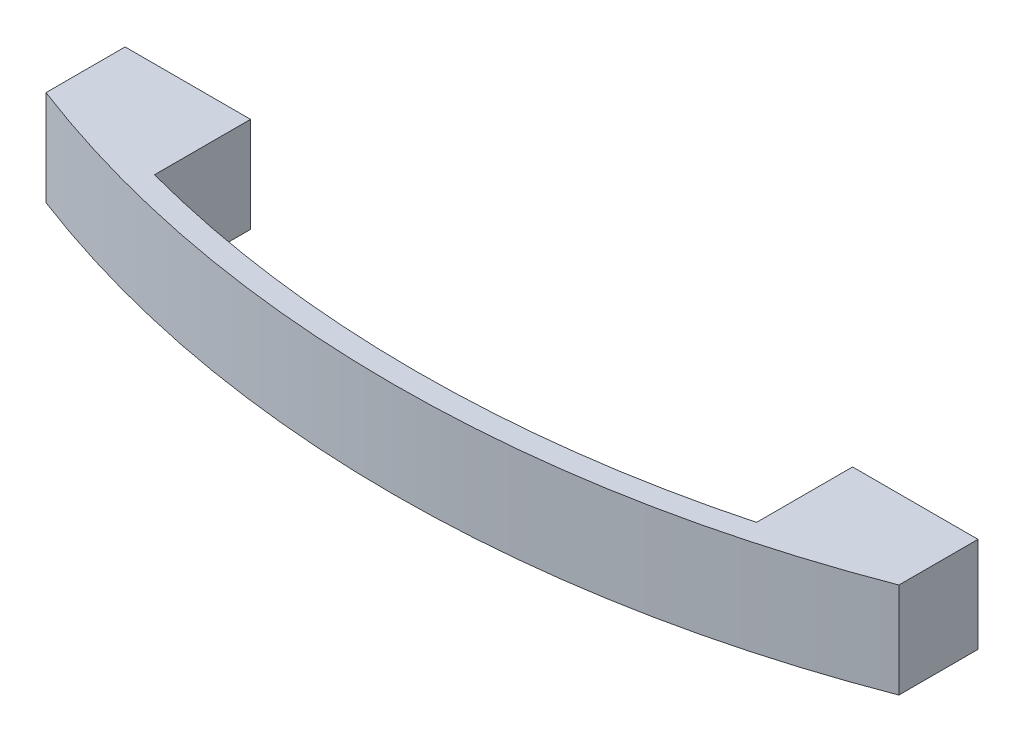
ISO-10303-21;
HEADER;
FILE_DESCRIPTION(('STEP AP214'),'2;1');
FILE_NAME('part.step','',(''),(''),'','','');
FILE_SCHEMA(('AUTOMOTIVE_DESIGN { 1 0 10303 214 1 1 1 1 }'));
ENDSEC;
DATA;
#1=APPLICATION_CONTEXT('core data for automotive mechanical design processes');
#2=APPLICATION_PROTOCOL_DEFINITION('international standard','automotive_design',2000,#1);
#3=PRODUCT_CONTEXT('',#1,'mechanical');
#4=PRODUCT('Part','Part','',(#3));
#5=PRODUCT_RELATED_PRODUCT_CATEGORY('part','',(#4));
#6=PRODUCT_DEFINITION_FORMATION('','',#4);
#7=PRODUCT_DEFINITION_CONTEXT('part definition',#1,'design');
#8=PRODUCT_DEFINITION('design','',#6,#7);
#9=PRODUCT_DEFINITION_SHAPE('','',#8);
#10=(LENGTH_UNIT() NAMED_UNIT(*) SI_UNIT(.MILLI.,.METRE.));
#11=(NAMED_UNIT(*) PLANE_ANGLE_UNIT() SI_UNIT($,.RADIAN.));
#12=(NAMED_UNIT(*) SI_UNIT($,.STERADIAN.) SOLID_ANGLE_UNIT());
#13=UNCERTAINTY_MEASURE_WITH_UNIT(LENGTH_MEASURE(1.E-05),#10,'distance_accuracy_value','');
#14=(GEOMETRIC_REPRESENTATION_CONTEXT(3) GLOBAL_UNCERTAINTY_ASSIGNED_CONTEXT((#13)) GLOBAL_UNIT_ASSIGNED_CONTEXT((#10,
#11,#12)) REPRESENTATION_CONTEXT('',''));
#15=CARTESIAN_POINT('',(0.,0.,0.));
#16=DIRECTION('',(0.,0.,1.));
#17=DIRECTION('',(1.,0.,0.));
#18=AXIS2_PLACEMENT_3D('',#15,#16,#17);
#19=CARTESIAN_POINT('',(0.,19.,0.));
#20=DIRECTION('',(0.,-1.,0.));
#21=DIRECTION('',(0.,0.,-1.));
#22=AXIS2_PLACEMENT_3D('',#19,#20,#21);
#23=CYLINDRICAL_SURFACE('',#22,233.);
#24=CARTESIAN_POINT('',(0.,0.,0.));
#25=DIRECTION('',(0.,-1.,0.));
#26=DIRECTION('',(0.,0.,1.));
#27=AXIS2_PLACEMENT_3D('',#24,#25,#26);
#28=CIRCLE('',#27,233.);
#29=CARTESIAN_POINT('',(60.,0.,225.142177301367));
#30=VERTEX_POINT('',#29);
#31=CARTESIAN_POINT('',(-60.,0.,225.142177301367));
#32=VERTEX_POINT('',#31);
#33=EDGE_CURVE('E156',#30,#32,#28,.T.);
#34=ORIENTED_EDGE('',*,*,#33,.T.);
#35=DIRECTION('',(0.,-1.,0.));
#36=VECTOR('',#35,1.);
#37=CARTESIAN_POINT('',(-60.,19.,225.142177301367));
#38=LINE('',#37,#36);
#39=CARTESIAN_POINT('',(-60.,19.,225.142177301367));
#40=VERTEX_POINT('',#39);
#41=EDGE_CURVE('E138',#40,#32,#38,.T.);
#42=ORIENTED_EDGE('',*,*,#41,.F.);
#43=CARTESIAN_POINT('',(0.,19.,0.));
#44=DIRECTION('',(0.,-1.,0.));
#45=DIRECTION('',(0.,0.,1.));
#46=AXIS2_PLACEMENT_3D('',#43,#44,#45);
#47=CIRCLE('',#46,233.);
#48=CARTESIAN_POINT('',(60.,19.,225.142177301367));
#49=VERTEX_POINT('',#48);
#50=EDGE_CURVE('E144',#49,#40,#47,.T.);
#51=ORIENTED_EDGE('',*,*,#50,.F.);
#52=DIRECTION('',(0.,-1.,0.));
#53=VECTOR('',#52,1.);
#54=CARTESIAN_POINT('',(60.,19.,225.142177301367));
#55=LINE('',#54,#53);
#56=EDGE_CURVE('E231',#49,#30,#55,.T.);
#57=ORIENTED_EDGE('',*,*,#56,.T.);
#58=EDGE_LOOP('',(#34,#42,#51,#57));
#59=FACE_BOUND('',#58,.T.);
#60=ADVANCED_FACE('F41',(#59),#23,.F.);
#61=CARTESIAN_POINT('',(-60.,19.,225.142177301367));
#62=DIRECTION('',(-1.,0.,0.));
#63=DIRECTION('',(0.,0.,1.));
#64=AXIS2_PLACEMENT_3D('',#61,#62,#63);
#65=PLANE('',#64);
#66=DIRECTION('',(0.,0.,-1.));
#67=VECTOR('',#66,1.);
#68=CARTESIAN_POINT('',(-60.,0.,225.142177301367));
#69=LINE('',#68,#67);
#70=CARTESIAN_POINT('',(-59.9999999999999,0.,206.));
#71=VERTEX_POINT('',#70);
#72=EDGE_CURVE('E245',#32,#71,#69,.T.);
#73=ORIENTED_EDGE('',*,*,#72,.T.);
#74=DIRECTION('',(0.,1.,0.));
#75=VECTOR('',#74,1.);
#76=CARTESIAN_POINT('',(-59.9999999999999,19.,206.));
#77=LINE('',#76,#75);
#78=CARTESIAN_POINT('',(-59.9999999999999,19.,206.));
#79=VERTEX_POINT('',#78);
#80=EDGE_CURVE('E141',#71,#79,#77,.T.);
#81=ORIENTED_EDGE('',*,*,#80,.T.);
#82=DIRECTION('',(0.,0.,-1.));
#83=VECTOR('',#82,1.);
#84=CARTESIAN_POINT('',(-60.,19.,225.142177301367));
#85=LINE('',#84,#83);
#86=EDGE_CURVE('E133',#40,#79,#85,.T.);
#87=ORIENTED_EDGE('',*,*,#86,.F.);
#88=ORIENTED_EDGE('',*,*,#41,.T.);
#89=EDGE_LOOP('',(#73,#81,#87,#88));
#90=FACE_BOUND('',#89,.T.);
#91=ADVANCED_FACE('F136',(#90),#65,.F.);
#92=CARTESIAN_POINT('',(-59.9999999999999,19.,205.));
#93=DIRECTION('',(0.,0.,1.));
#94=DIRECTION('',(1.,0.,0.));
#95=AXIS2_PLACEMENT_3D('',#92,#93,#94);
#96=PLANE('',#95);
#97=DIRECTION('',(1.,0.,0.));
#98=VECTOR('',#97,1.);
#99=CARTESIAN_POINT('',(-59.9999999999999,18.,205.));
#100=LINE('',#99,#98);
#101=CARTESIAN_POINT('',(-83.9999999999999,18.,205.));
#102=VERTEX_POINT('',#101);
#103=CARTESIAN_POINT('',(-60.9999999999999,18.,205.));
#104=VERTEX_POINT('',#103);
#105=EDGE_CURVE('E168',#102,#104,#100,.T.);
#106=ORIENTED_EDGE('',*,*,#105,.T.);
#107=DIRECTION('',(0.,-1.,0.));
#108=VECTOR('',#107,1.);
#109=CARTESIAN_POINT('',(-60.9999999999999,19.,205.));
#110=LINE('',#109,#108);
#111=CARTESIAN_POINT('',(-60.9999999999999,0.999999999999987,205.));
#112=VERTEX_POINT('',#111);
#113=EDGE_CURVE('E170',#104,#112,#110,.T.);
#114=ORIENTED_EDGE('',*,*,#113,.T.);
#115=DIRECTION('',(-1.,0.,0.));
#116=VECTOR('',#115,1.);
#117=CARTESIAN_POINT('',(-59.9999999999999,0.999999999999987,205.));
#118=LINE('',#117,#116);
#119=CARTESIAN_POINT('',(-83.9999999999999,0.999999999999987,205.));
#120=VERTEX_POINT('',#119);
#121=EDGE_CURVE('E157',#112,#120,#118,.T.);
#122=ORIENTED_EDGE('',*,*,#121,.T.);
#123=DIRECTION('',(0.,1.,0.));
#124=VECTOR('',#123,1.);
#125=CARTESIAN_POINT('',(-83.9999999999999,19.,205.));
#126=LINE('',#125,#124);
#127=EDGE_CURVE('E160',#120,#102,#126,.T.);
#128=ORIENTED_EDGE('',*,*,#127,.T.);
#129=EDGE_LOOP('',(#106,#114,#122,#128));
#130=FACE_BOUND('',#129,.T.);
#131=ADVANCED_FACE('F271',(#130),#96,.F.);
#132=CARTESIAN_POINT('',(-84.9999999999999,19.,205.));
#133=DIRECTION('',(1.,0.,0.));
#134=DIRECTION('',(0.,0.,-1.));
#135=AXIS2_PLACEMENT_3D('',#132,#133,#134);
#136=PLANE('',#135);
#137=DIRECTION('',(0.,0.,1.));
#138=VECTOR('',#137,1.);
#139=CARTESIAN_POINT('',(-84.9999999999999,19.,205.));
#140=LINE('',#139,#138);
#141=CARTESIAN_POINT('',(-84.9999999999999,19.,206.));
#142=VERTEX_POINT('',#141);
#143=CARTESIAN_POINT('',(-84.9999999999999,19.,221.768460336451));
#144=VERTEX_POINT('',#143);
#145=EDGE_CURVE('E143',#142,#144,#140,.T.);
#146=ORIENTED_EDGE('',*,*,#145,.F.);
#147=DIRECTION('',(0.,-1.,0.));
#148=VECTOR('',#147,1.);
#149=CARTESIAN_POINT('',(-84.9999999999999,19.,206.));
#150=LINE('',#149,#148);
#151=CARTESIAN_POINT('',(-84.9999999999999,0.,206.));
#152=VERTEX_POINT('',#151);
#153=EDGE_CURVE('E178',#142,#152,#150,.T.);
#154=ORIENTED_EDGE('',*,*,#153,.T.);
#155=DIRECTION('',(0.,0.,1.));
#156=VECTOR('',#155,1.);
#157=CARTESIAN_POINT('',(-84.9999999999999,0.,205.));
#158=LINE('',#157,#156);
#159=CARTESIAN_POINT('',(-84.9999999999999,0.,221.768460336451));
#160=VERTEX_POINT('',#159);
#161=EDGE_CURVE('E243',#152,#160,#158,.T.);
#162=ORIENTED_EDGE('',*,*,#161,.T.);
#163=DIRECTION('',(0.,-1.,0.));
#164=VECTOR('',#163,1.);
#165=CARTESIAN_POINT('',(-84.9999999999999,19.,221.768460336451));
#166=LINE('',#165,#164);
#167=EDGE_CURVE('E158',#144,#160,#166,.T.);
#168=ORIENTED_EDGE('',*,*,#167,.F.);
#169=EDGE_LOOP('',(#146,#154,#162,#168));
#170=FACE_BOUND('',#169,.T.);
#171=ADVANCED_FACE('F259',(#170),#136,.F.);
#172=CARTESIAN_POINT('',(0.,19.,0.));
#173=DIRECTION('',(0.,-1.,0.));
#174=DIRECTION('',(0.,0.,-1.));
#175=AXIS2_PLACEMENT_3D('',#172,#173,#174);
#176=CYLINDRICAL_SURFACE('',#175,237.5);
#177=CARTESIAN_POINT('',(0.,0.,0.));
#178=DIRECTION('',(0.,1.,0.));
#179=DIRECTION('',(0.,0.,1.));
#180=AXIS2_PLACEMENT_3D('',#177,#178,#179);
#181=CIRCLE('',#180,237.5);
#182=CARTESIAN_POINT('',(84.9999999999999,0.,221.768460336451));
#183=VERTEX_POINT('',#182);
#184=EDGE_CURVE('E227',#160,#183,#181,.T.);
#185=ORIENTED_EDGE('',*,*,#184,.T.);
#186=DIRECTION('',(0.,-1.,0.));
#187=VECTOR('',#186,1.);
#188=CARTESIAN_POINT('',(84.9999999999999,19.,221.768460336451));
#189=LINE('',#188,#187);
#190=CARTESIAN_POINT('',(84.9999999999999,19.,221.768460336451));
#191=VERTEX_POINT('',#190);
#192=EDGE_CURVE('E163',#191,#183,#189,.T.);
#193=ORIENTED_EDGE('',*,*,#192,.F.);
#194=CARTESIAN_POINT('',(0.,19.,0.));
#195=DIRECTION('',(0.,1.,0.));
#196=DIRECTION('',(0.,0.,1.));
#197=AXIS2_PLACEMENT_3D('',#194,#195,#196);
#198=CIRCLE('',#197,237.5);
#199=EDGE_CURVE('E252',#144,#191,#198,.T.);
#200=ORIENTED_EDGE('',*,*,#199,.F.);
#201=ORIENTED_EDGE('',*,*,#167,.T.);
#202=EDGE_LOOP('',(#185,#193,#200,#201));
#203=FACE_BOUND('',#202,.T.);
#204=ADVANCED_FACE('F260',(#203),#176,.T.);
#205=CARTESIAN_POINT('',(85.,19.,205.));
#206=DIRECTION('',(-1.,0.,0.));
#207=DIRECTION('',(0.,0.,1.));
#208=AXIS2_PLACEMENT_3D('',#205,#206,#207);
#209=PLANE('',#208);
#210=DIRECTION('',(0.,0.,-1.));
#211=VECTOR('',#210,1.);
#212=CARTESIAN_POINT('',(85.,0.,205.));
#213=LINE('',#212,#211);
#214=CARTESIAN_POINT('',(85.,0.,206.));
#215=VERTEX_POINT('',#214);
#216=EDGE_CURVE('E225',#183,#215,#213,.T.);
#217=ORIENTED_EDGE('',*,*,#216,.T.);
#218=DIRECTION('',(0.,1.,0.));
#219=VECTOR('',#218,1.);
#220=CARTESIAN_POINT('',(85.,19.,206.));
#221=LINE('',#220,#219);
#222=CARTESIAN_POINT('',(85.,19.,206.));
#223=VERTEX_POINT('',#222);
#224=EDGE_CURVE('E51',#215,#223,#221,.T.);
#225=ORIENTED_EDGE('',*,*,#224,.T.);
#226=DIRECTION('',(0.,0.,-1.));
#227=VECTOR('',#226,1.);
#228=CARTESIAN_POINT('',(85.,19.,205.));
#229=LINE('',#228,#227);
#230=EDGE_CURVE('E239',#191,#223,#229,.T.);
#231=ORIENTED_EDGE('',*,*,#230,.F.);
#232=ORIENTED_EDGE('',*,*,#192,.T.);
#233=EDGE_LOOP('',(#217,#225,#231,#232));
#234=FACE_BOUND('',#233,.T.);
#235=ADVANCED_FACE('F236',(#234),#209,.F.);
#236=CARTESIAN_POINT('',(60.,19.,205.));
#237=DIRECTION('',(0.,0.,1.));
#238=DIRECTION('',(1.,0.,0.));
#239=AXIS2_PLACEMENT_3D('',#236,#237,#238);
#240=PLANE('',#239);
#241=DIRECTION('',(1.,0.,0.));
#242=VECTOR('',#241,1.);
#243=CARTESIAN_POINT('',(85.,18.,205.));
#244=LINE('',#243,#242);
#245=CARTESIAN_POINT('',(61.,18.,205.));
#246=VERTEX_POINT('',#245);
#247=CARTESIAN_POINT('',(84.,18.,205.));
#248=VERTEX_POINT('',#247);
#249=EDGE_CURVE('E59',#246,#248,#244,.T.);
#250=ORIENTED_EDGE('',*,*,#249,.T.);
#251=DIRECTION('',(0.,-1.,0.));
#252=VECTOR('',#251,1.);
#253=CARTESIAN_POINT('',(84.,19.,205.));
#254=LINE('',#253,#252);
#255=CARTESIAN_POINT('',(84.,0.999999999999973,205.));
#256=VERTEX_POINT('',#255);
#257=EDGE_CURVE('E188',#248,#256,#254,.T.);
#258=ORIENTED_EDGE('',*,*,#257,.T.);
#259=DIRECTION('',(-1.,0.,0.));
#260=VECTOR('',#259,1.);
#261=CARTESIAN_POINT('',(60.,0.999999999999973,205.));
#262=LINE('',#261,#260);
#263=CARTESIAN_POINT('',(61.,0.999999999999973,205.));
#264=VERTEX_POINT('',#263);
#265=EDGE_CURVE('E184',#256,#264,#262,.T.);
#266=ORIENTED_EDGE('',*,*,#265,.T.);
#267=DIRECTION('',(0.,1.,0.));
#268=VECTOR('',#267,1.);
#269=CARTESIAN_POINT('',(61.,19.,205.));
#270=LINE('',#269,#268);
#271=EDGE_CURVE('E64',#264,#246,#270,.T.);
#272=ORIENTED_EDGE('',*,*,#271,.T.);
#273=EDGE_LOOP('',(#250,#258,#266,#272));
#274=FACE_BOUND('',#273,.T.);
#275=ADVANCED_FACE('F268',(#274),#240,.F.);
#276=CARTESIAN_POINT('',(60.,19.,225.142177301367));
#277=DIRECTION('',(1.,0.,0.));
#278=DIRECTION('',(0.,0.,-1.));
#279=AXIS2_PLACEMENT_3D('',#276,#277,#278);
#280=PLANE('',#279);
#281=DIRECTION('',(0.,0.,1.));
#282=VECTOR('',#281,1.);
#283=CARTESIAN_POINT('',(60.,19.,225.142177301367));
#284=LINE('',#283,#282);
#285=CARTESIAN_POINT('',(60.,19.,206.));
#286=VERTEX_POINT('',#285);
#287=EDGE_CURVE('E149',#286,#49,#284,.T.);
#288=ORIENTED_EDGE('',*,*,#287,.F.);
#289=DIRECTION('',(0.,-1.,0.));
#290=VECTOR('',#289,1.);
#291=CARTESIAN_POINT('',(60.,19.,206.));
#292=LINE('',#291,#290);
#293=CARTESIAN_POINT('',(60.,0.,206.));
#294=VERTEX_POINT('',#293);
#295=EDGE_CURVE('E11',#286,#294,#292,.T.);
#296=ORIENTED_EDGE('',*,*,#295,.T.);
#297=DIRECTION('',(0.,0.,1.));
#298=VECTOR('',#297,1.);
#299=CARTESIAN_POINT('',(60.,0.,225.142177301367));
#300=LINE('',#299,#298);
#301=EDGE_CURVE('E153',#294,#30,#300,.T.);
#302=ORIENTED_EDGE('',*,*,#301,.T.);
#303=ORIENTED_EDGE('',*,*,#56,.F.);
#304=EDGE_LOOP('',(#288,#296,#302,#303));
#305=FACE_BOUND('',#304,.T.);
#306=ADVANCED_FACE('F219',(#305),#280,.F.);
#307=CARTESIAN_POINT('',(0.,19.,0.));
#308=DIRECTION('',(0.,1.,0.));
#309=DIRECTION('',(0.,0.,1.));
#310=AXIS2_PLACEMENT_3D('',#307,#308,#309);
#311=PLANE('',#310);
#312=ORIENTED_EDGE('',*,*,#86,.T.);
#313=DIRECTION('',(-1.,0.,0.));
#314=VECTOR('',#313,1.);
#315=CARTESIAN_POINT('',(-84.9999999999999,19.,206.));
#316=LINE('',#315,#314);
#317=EDGE_CURVE('E176',#79,#142,#316,.T.);
#318=ORIENTED_EDGE('',*,*,#317,.T.);
#319=ORIENTED_EDGE('',*,*,#145,.T.);
#320=ORIENTED_EDGE('',*,*,#199,.T.);
#321=ORIENTED_EDGE('',*,*,#230,.T.);
#322=DIRECTION('',(-1.,0.,0.));
#323=VECTOR('',#322,1.);
#324=CARTESIAN_POINT('',(60.,19.,206.));
#325=LINE('',#324,#323);
#326=EDGE_CURVE('E174',#223,#286,#325,.T.);
#327=ORIENTED_EDGE('',*,*,#326,.T.);
#328=ORIENTED_EDGE('',*,*,#287,.T.);
#329=ORIENTED_EDGE('',*,*,#50,.T.);
#330=EDGE_LOOP('',(#312,#318,#319,#320,#321,#327,#328,#329));
#331=FACE_BOUND('',#330,.T.);
#332=ADVANCED_FACE('F147',(#331),#311,.T.);
#333=CARTESIAN_POINT('',(0.,0.,0.));
#334=DIRECTION('',(0.,1.,0.));
#335=DIRECTION('',(0.,0.,1.));
#336=AXIS2_PLACEMENT_3D('',#333,#334,#335);
#337=PLANE('',#336);
#338=ORIENTED_EDGE('',*,*,#161,.F.);
#339=DIRECTION('',(1.,0.,0.));
#340=VECTOR('',#339,1.);
#341=CARTESIAN_POINT('',(0.,0.,206.));
#342=LINE('',#341,#340);
#343=EDGE_CURVE('E182',#152,#71,#342,.T.);
#344=ORIENTED_EDGE('',*,*,#343,.T.);
#345=ORIENTED_EDGE('',*,*,#72,.F.);
#346=ORIENTED_EDGE('',*,*,#33,.F.);
#347=ORIENTED_EDGE('',*,*,#301,.F.);
#348=DIRECTION('',(1.,0.,0.));
#349=VECTOR('',#348,1.);
#350=CARTESIAN_POINT('',(0.,0.,206.));
#351=LINE('',#350,#349);
#352=EDGE_CURVE('E180',#294,#215,#351,.T.);
#353=ORIENTED_EDGE('',*,*,#352,.T.);
#354=ORIENTED_EDGE('',*,*,#216,.F.);
#355=ORIENTED_EDGE('',*,*,#184,.F.);
#356=EDGE_LOOP('',(#338,#344,#345,#346,#347,#353,#354,#355));
#357=FACE_BOUND('',#356,.T.);
#358=ADVANCED_FACE('F222',(#357),#337,.F.);
#359=CARTESIAN_POINT('',(-84.9999999999999,19.,206.));
#360=DIRECTION('',(0.707106781186552,0.,0.707106781186543));
#361=DIRECTION('',(0.,-1.,0.));
#362=AXIS2_PLACEMENT_3D('',#359,#360,#361);
#363=PLANE('',#362);
#364=DIRECTION('',(0.577350269189623,0.577350269189623,-0.577350269189631));
#365=VECTOR('',#364,1.);
#366=CARTESIAN_POINT('',(-76.,8.99999999999992,197.));
#367=LINE('',#366,#365);
#368=EDGE_CURVE('E196',#152,#120,#367,.T.);
#369=ORIENTED_EDGE('',*,*,#368,.F.);
#370=ORIENTED_EDGE('',*,*,#153,.F.);
#371=DIRECTION('',(-0.577350269189623,0.577350269189623,0.577350269189631));
#372=VECTOR('',#371,1.);
#373=CARTESIAN_POINT('',(-84.9999999999999,19.,206.));
#374=LINE('',#373,#372);
#375=EDGE_CURVE('E199',#102,#142,#374,.T.);
#376=ORIENTED_EDGE('',*,*,#375,.F.);
#377=ORIENTED_EDGE('',*,*,#127,.F.);
#378=EDGE_LOOP('',(#369,#370,#376,#377));
#379=FACE_BOUND('',#378,.T.);
#380=ADVANCED_FACE('F300',(#379),#363,.F.);
#381=CARTESIAN_POINT('',(0.,19.,206.));
#382=DIRECTION('',(0.,0.707106781186552,-0.707106781186543));
#383=DIRECTION('',(1.,0.,0.));
#384=AXIS2_PLACEMENT_3D('',#381,#382,#383);
#385=PLANE('',#384);
#386=ORIENTED_EDGE('',*,*,#375,.T.);
#387=ORIENTED_EDGE('',*,*,#317,.F.);
#388=DIRECTION('',(0.577350269189623,0.577350269189623,0.577350269189631));
#389=VECTOR('',#388,1.);
#390=CARTESIAN_POINT('',(-40.0000000000001,38.9999999999998,226.));
#391=LINE('',#390,#389);
#392=EDGE_CURVE('E194',#104,#79,#391,.T.);
#393=ORIENTED_EDGE('',*,*,#392,.F.);
#394=ORIENTED_EDGE('',*,*,#105,.F.);
#395=EDGE_LOOP('',(#386,#387,#393,#394));
#396=FACE_BOUND('',#395,.T.);
#397=ADVANCED_FACE('F293',(#396),#385,.T.);
#398=CARTESIAN_POINT('',(-59.9999999999999,0.999999999999987,205.));
#399=DIRECTION('',(0.,0.707106781186552,0.707106781186543));
#400=DIRECTION('',(-1.,0.,0.));
#401=AXIS2_PLACEMENT_3D('',#398,#399,#400);
#402=PLANE('',#401);
#403=ORIENTED_EDGE('',*,*,#368,.T.);
#404=ORIENTED_EDGE('',*,*,#121,.F.);
#405=DIRECTION('',(0.577350269189623,-0.577350269189623,0.577350269189631));
#406=VECTOR('',#405,1.);
#407=CARTESIAN_POINT('',(-60.6666666666666,0.666666666666661,205.333333333333));
#408=LINE('',#407,#406);
#409=EDGE_CURVE('E192',#71,#112,#408,.F.);
#410=ORIENTED_EDGE('',*,*,#409,.F.);
#411=ORIENTED_EDGE('',*,*,#343,.F.);
#412=EDGE_LOOP('',(#403,#404,#410,#411));
#413=FACE_BOUND('',#412,.T.);
#414=ADVANCED_FACE('F286',(#413),#402,.F.);
#415=CARTESIAN_POINT('',(-60.9999999999999,19.,205.));
#416=DIRECTION('',(-0.707106781186552,0.,0.707106781186543));
#417=DIRECTION('',(0.,-1.,0.));
#418=AXIS2_PLACEMENT_3D('',#415,#416,#417);
#419=PLANE('',#418);
#420=ORIENTED_EDGE('',*,*,#392,.T.);
#421=ORIENTED_EDGE('',*,*,#80,.F.);
#422=ORIENTED_EDGE('',*,*,#409,.T.);
#423=ORIENTED_EDGE('',*,*,#113,.F.);
#424=EDGE_LOOP('',(#420,#421,#422,#423));
#425=FACE_BOUND('',#424,.T.);
#426=ADVANCED_FACE('F280',(#425),#419,.F.);
#427=CARTESIAN_POINT('',(60.,19.,206.));
#428=DIRECTION('',(0.707106781186548,0.,0.707106781186548));
#429=DIRECTION('',(0.,-1.,0.));
#430=AXIS2_PLACEMENT_3D('',#427,#428,#429);
#431=PLANE('',#430);
#432=DIRECTION('',(0.577350269189626,0.577350269189626,-0.577350269189626));
#433=VECTOR('',#432,1.);
#434=CARTESIAN_POINT('',(60.6666666666666,0.666666666666649,205.333333333333));
#435=LINE('',#434,#433);
#436=EDGE_CURVE('E205',#294,#264,#435,.T.);
#437=ORIENTED_EDGE('',*,*,#436,.F.);
#438=ORIENTED_EDGE('',*,*,#295,.F.);
#439=DIRECTION('',(-0.577350269189626,0.577350269189626,0.577350269189626));
#440=VECTOR('',#439,1.);
#441=CARTESIAN_POINT('',(60.,19.,206.));
#442=LINE('',#441,#440);
#443=EDGE_CURVE('E46',#246,#286,#442,.T.);
#444=ORIENTED_EDGE('',*,*,#443,.F.);
#445=ORIENTED_EDGE('',*,*,#271,.F.);
#446=EDGE_LOOP('',(#437,#438,#444,#445));
#447=FACE_BOUND('',#446,.T.);
#448=ADVANCED_FACE('F44',(#447),#431,.F.);
#449=CARTESIAN_POINT('',(0.,19.,206.));
#450=DIRECTION('',(0.,0.707106781186548,-0.707106781186548));
#451=DIRECTION('',(1.,0.,0.));
#452=AXIS2_PLACEMENT_3D('',#449,#450,#451);
#453=PLANE('',#452);
#454=ORIENTED_EDGE('',*,*,#443,.T.);
#455=ORIENTED_EDGE('',*,*,#326,.F.);
#456=DIRECTION('',(0.577350269189626,0.577350269189626,0.577350269189626));
#457=VECTOR('',#456,1.);
#458=CARTESIAN_POINT('',(56.6666666666667,-9.33333333333333,177.666666666667));
#459=LINE('',#458,#457);
#460=EDGE_CURVE('E204',#248,#223,#459,.T.);
#461=ORIENTED_EDGE('',*,*,#460,.F.);
#462=ORIENTED_EDGE('',*,*,#249,.F.);
#463=EDGE_LOOP('',(#454,#455,#461,#462));
#464=FACE_BOUND('',#463,.T.);
#465=ADVANCED_FACE('F214',(#464),#453,.T.);
#466=CARTESIAN_POINT('',(60.,0.999999999999973,205.));
#467=DIRECTION('',(0.,0.707106781186548,0.707106781186548));
#468=DIRECTION('',(-1.,0.,0.));
#469=AXIS2_PLACEMENT_3D('',#466,#467,#468);
#470=PLANE('',#469);
#471=ORIENTED_EDGE('',*,*,#436,.T.);
#472=ORIENTED_EDGE('',*,*,#265,.F.);
#473=DIRECTION('',(0.577350269189626,-0.577350269189626,0.577350269189626));
#474=VECTOR('',#473,1.);
#475=CARTESIAN_POINT('',(76.,8.99999999999998,197.));
#476=LINE('',#475,#474);
#477=EDGE_CURVE('E202',#215,#256,#476,.F.);
#478=ORIENTED_EDGE('',*,*,#477,.F.);
#479=ORIENTED_EDGE('',*,*,#352,.F.);
#480=EDGE_LOOP('',(#471,#472,#478,#479));
#481=FACE_BOUND('',#480,.T.);
#482=ADVANCED_FACE('F314',(#481),#470,.F.);
#483=CARTESIAN_POINT('',(84.,19.,205.));
#484=DIRECTION('',(-0.707106781186548,0.,0.707106781186548));
#485=DIRECTION('',(0.,-1.,0.));
#486=AXIS2_PLACEMENT_3D('',#483,#484,#485);
#487=PLANE('',#486);
#488=ORIENTED_EDGE('',*,*,#460,.T.);
#489=ORIENTED_EDGE('',*,*,#224,.F.);
#490=ORIENTED_EDGE('',*,*,#477,.T.);
#491=ORIENTED_EDGE('',*,*,#257,.F.);
#492=EDGE_LOOP('',(#488,#489,#490,#491));
#493=FACE_BOUND('',#492,.T.);
#494=ADVANCED_FACE('F308',(#493),#487,.F.);
#495=CLOSED_SHELL('',(#60,#91,#131,#171,#204,#235,#275,#306,#332,#358,#380,#397,#414,#426,#448,
#465,#482,#494));
#496=MANIFOLD_SOLID_BREP('B2',#495);
#497=ADVANCED_BREP_SHAPE_REPRESENTATION('',(#18,#496),#14);
#498=SHAPE_DEFINITION_REPRESENTATION(#9,#497);
ENDSEC;
END-ISO-10303-21;
